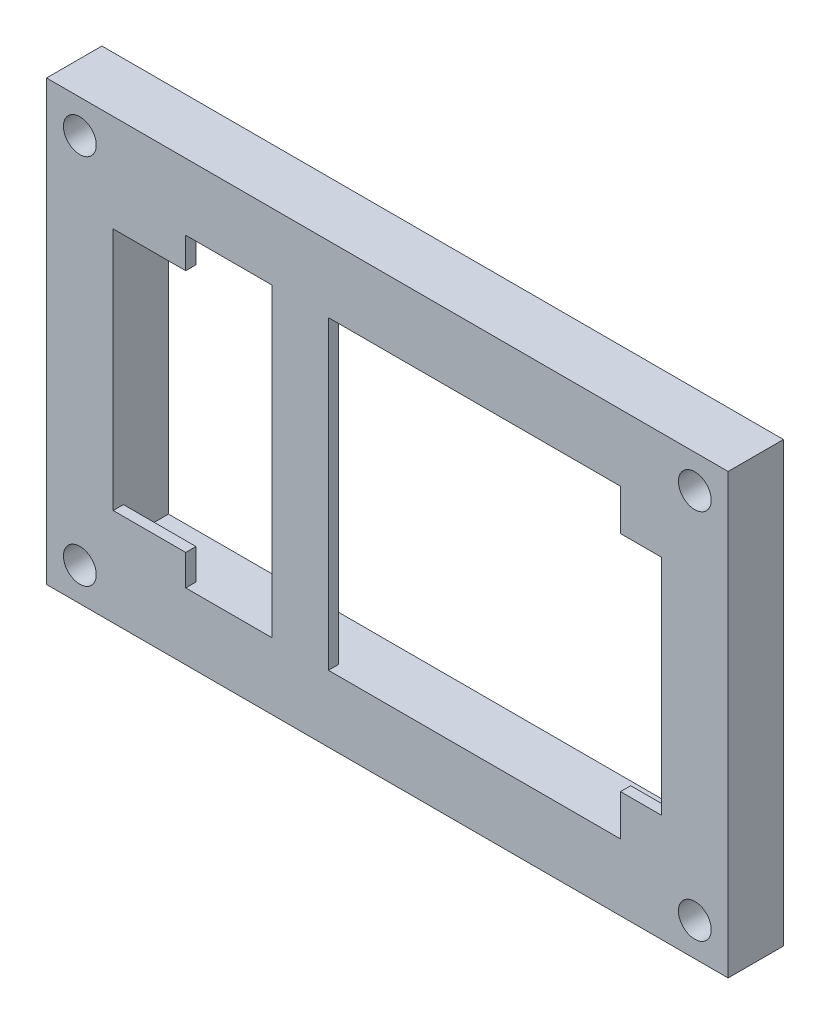
ISO-10303-21;
HEADER;
FILE_DESCRIPTION(('STEP AP214'),'2;1');
FILE_NAME('part.step','',(''),(''),'','','');
FILE_SCHEMA(('AUTOMOTIVE_DESIGN { 1 0 10303 214 1 1 1 1 }'));
ENDSEC;
DATA;
#1=APPLICATION_CONTEXT('core data for automotive mechanical design processes');
#2=APPLICATION_PROTOCOL_DEFINITION('international standard','automotive_design',2000,#1);
#3=PRODUCT_CONTEXT('',#1,'mechanical');
#4=PRODUCT('Part','Part','',(#3));
#5=PRODUCT_RELATED_PRODUCT_CATEGORY('part','',(#4));
#6=PRODUCT_DEFINITION_FORMATION('','',#4);
#7=PRODUCT_DEFINITION_CONTEXT('part definition',#1,'design');
#8=PRODUCT_DEFINITION('design','',#6,#7);
#9=PRODUCT_DEFINITION_SHAPE('','',#8);
#10=(LENGTH_UNIT() NAMED_UNIT(*) SI_UNIT(.MILLI.,.METRE.));
#11=(NAMED_UNIT(*) PLANE_ANGLE_UNIT() SI_UNIT($,.RADIAN.));
#12=(NAMED_UNIT(*) SI_UNIT($,.STERADIAN.) SOLID_ANGLE_UNIT());
#13=UNCERTAINTY_MEASURE_WITH_UNIT(LENGTH_MEASURE(1.E-05),#10,'distance_accuracy_value','');
#14=(GEOMETRIC_REPRESENTATION_CONTEXT(3) GLOBAL_UNCERTAINTY_ASSIGNED_CONTEXT((#13)) GLOBAL_UNIT_ASSIGNED_CONTEXT((#10,
#11,#12)) REPRESENTATION_CONTEXT('',''));
#15=CARTESIAN_POINT('',(0.,0.,0.));
#16=DIRECTION('',(0.,0.,1.));
#17=DIRECTION('',(1.,0.,0.));
#18=AXIS2_PLACEMENT_3D('',#15,#16,#17);
#19=CARTESIAN_POINT('',(-95.848753826431,54.5182768069801,0.));
#20=DIRECTION('',(-1.,0.,0.));
#21=DIRECTION('',(0.,-1.,0.));
#22=AXIS2_PLACEMENT_3D('',#19,#20,#21);
#23=PLANE('',#22);
#24=DIRECTION('',(0.,-1.,0.));
#25=VECTOR('',#24,1.);
#26=CARTESIAN_POINT('',(-95.8487538264309,27.7182768069801,4.4));
#27=LINE('',#26,#25);
#28=CARTESIAN_POINT('',(-95.8487538264309,27.7182768069801,4.4));
#29=VERTEX_POINT('',#28);
#30=CARTESIAN_POINT('',(-95.8487538264309,24.7182768069801,4.4));
#31=VERTEX_POINT('',#30);
#32=EDGE_CURVE('E220',#29,#31,#27,.T.);
#33=ORIENTED_EDGE('',*,*,#32,.T.);
#34=DIRECTION('',(0.,0.,1.));
#35=VECTOR('',#34,1.);
#36=CARTESIAN_POINT('',(-95.8487538264309,24.7182768069801,0.));
#37=LINE('',#36,#35);
#38=CARTESIAN_POINT('',(-95.8487538264309,24.7182768069801,0.));
#39=VERTEX_POINT('',#38);
#40=EDGE_CURVE('E364',#39,#31,#37,.T.);
#41=ORIENTED_EDGE('',*,*,#40,.F.);
#42=DIRECTION('',(0.,-1.,0.));
#43=VECTOR('',#42,1.);
#44=CARTESIAN_POINT('',(-95.848753826431,54.5182768069801,0.));
#45=LINE('',#44,#43);
#46=CARTESIAN_POINT('',(-95.848753826431,54.5182768069801,0.));
#47=VERTEX_POINT('',#46);
#48=EDGE_CURVE('E344',#47,#39,#45,.T.);
#49=ORIENTED_EDGE('',*,*,#48,.F.);
#50=DIRECTION('',(0.,0.,1.));
#51=VECTOR('',#50,1.);
#52=CARTESIAN_POINT('',(-95.848753826431,54.5182768069801,0.));
#53=LINE('',#52,#51);
#54=CARTESIAN_POINT('',(-95.848753826431,54.5182768069801,4.4));
#55=VERTEX_POINT('',#54);
#56=EDGE_CURVE('E366',#47,#55,#53,.T.);
#57=ORIENTED_EDGE('',*,*,#56,.T.);
#58=DIRECTION('',(0.,1.,0.));
#59=VECTOR('',#58,1.);
#60=CARTESIAN_POINT('',(-95.848753826431,51.5182768069801,4.4));
#61=LINE('',#60,#59);
#62=CARTESIAN_POINT('',(-95.848753826431,51.5182768069801,4.4));
#63=VERTEX_POINT('',#62);
#64=EDGE_CURVE('E247',#63,#55,#61,.T.);
#65=ORIENTED_EDGE('',*,*,#64,.F.);
#66=DIRECTION('',(0.,0.,-1.));
#67=VECTOR('',#66,1.);
#68=CARTESIAN_POINT('',(-95.848753826431,51.5182768069801,5.4));
#69=LINE('',#68,#67);
#70=CARTESIAN_POINT('',(-95.848753826431,51.5182768069801,5.4));
#71=VERTEX_POINT('',#70);
#72=EDGE_CURVE('E229',#71,#63,#69,.T.);
#73=ORIENTED_EDGE('',*,*,#72,.F.);
#74=DIRECTION('',(0.,-1.,0.));
#75=VECTOR('',#74,1.);
#76=CARTESIAN_POINT('',(-95.848753826431,54.5182768069801,5.4));
#77=LINE('',#76,#75);
#78=CARTESIAN_POINT('',(-95.8487538264309,27.7182768069801,5.4));
#79=VERTEX_POINT('',#78);
#80=EDGE_CURVE('E356',#71,#79,#77,.T.);
#81=ORIENTED_EDGE('',*,*,#80,.T.);
#82=DIRECTION('',(0.,0.,1.));
#83=VECTOR('',#82,1.);
#84=CARTESIAN_POINT('',(-95.8487538264309,27.7182768069801,5.4));
#85=LINE('',#84,#83);
#86=EDGE_CURVE('E49',#29,#79,#85,.T.);
#87=ORIENTED_EDGE('',*,*,#86,.F.);
#88=EDGE_LOOP('',(#33,#41,#49,#57,#65,#73,#81,#87));
#89=FACE_BOUND('',#88,.T.);
#90=ADVANCED_FACE('F32',(#89),#23,.F.);
#91=CARTESIAN_POINT('',(-42.3487538264309,24.7182768069801,0.));
#92=DIRECTION('',(0.,-1.,0.));
#93=DIRECTION('',(1.,0.,0.));
#94=AXIS2_PLACEMENT_3D('',#91,#92,#93);
#95=PLANE('',#94);
#96=DIRECTION('',(0.,0.,-1.));
#97=VECTOR('',#96,1.);
#98=CARTESIAN_POINT('',(-88.7687538264309,24.7182768069801,5.4));
#99=LINE('',#98,#97);
#100=CARTESIAN_POINT('',(-88.7687538264309,24.7182768069801,5.4));
#101=VERTEX_POINT('',#100);
#102=CARTESIAN_POINT('',(-88.7687538264309,24.7182768069801,4.4));
#103=VERTEX_POINT('',#102);
#104=EDGE_CURVE('E224',#101,#103,#99,.T.);
#105=ORIENTED_EDGE('',*,*,#104,.F.);
#106=DIRECTION('',(1.,0.,0.));
#107=VECTOR('',#106,1.);
#108=CARTESIAN_POINT('',(-42.3487538264309,24.7182768069801,5.4));
#109=LINE('',#108,#107);
#110=CARTESIAN_POINT('',(-80.348753826431,24.7182768069801,5.4));
#111=VERTEX_POINT('',#110);
#112=EDGE_CURVE('E210',#101,#111,#109,.T.);
#113=ORIENTED_EDGE('',*,*,#112,.T.);
#114=DIRECTION('',(0.,0.,-1.));
#115=VECTOR('',#114,1.);
#116=CARTESIAN_POINT('',(-80.348753826431,24.7182768069801,5.4));
#117=LINE('',#116,#115);
#118=CARTESIAN_POINT('',(-80.348753826431,24.7182768069801,4.4));
#119=VERTEX_POINT('',#118);
#120=EDGE_CURVE('E315',#111,#119,#117,.T.);
#121=ORIENTED_EDGE('',*,*,#120,.T.);
#122=DIRECTION('',(1.,0.,0.));
#123=VECTOR('',#122,1.);
#124=CARTESIAN_POINT('',(-80.348753826431,24.7182768069801,4.4));
#125=LINE('',#124,#123);
#126=CARTESIAN_POINT('',(-74.8487538264309,24.7182768069801,4.4));
#127=VERTEX_POINT('',#126);
#128=EDGE_CURVE('E312',#119,#127,#125,.T.);
#129=ORIENTED_EDGE('',*,*,#128,.T.);
#130=DIRECTION('',(0.,0.,1.));
#131=VECTOR('',#130,1.);
#132=CARTESIAN_POINT('',(-74.8487538264309,24.7182768069801,4.4));
#133=LINE('',#132,#131);
#134=CARTESIAN_POINT('',(-74.8487538264309,24.7182768069801,5.4));
#135=VERTEX_POINT('',#134);
#136=EDGE_CURVE('E302',#127,#135,#133,.T.);
#137=ORIENTED_EDGE('',*,*,#136,.T.);
#138=CARTESIAN_POINT('',(-46.3487538264309,24.7182768069801,5.4));
#139=VERTEX_POINT('',#138);
#140=EDGE_CURVE('E358',#135,#139,#109,.T.);
#141=ORIENTED_EDGE('',*,*,#140,.T.);
#142=DIRECTION('',(0.,0.,1.));
#143=VECTOR('',#142,1.);
#144=CARTESIAN_POINT('',(-46.3487538264309,24.7182768069801,5.4));
#145=LINE('',#144,#143);
#146=CARTESIAN_POINT('',(-46.3487538264309,24.7182768069801,4.4));
#147=VERTEX_POINT('',#146);
#148=EDGE_CURVE('E254',#147,#139,#145,.T.);
#149=ORIENTED_EDGE('',*,*,#148,.F.);
#150=DIRECTION('',(-1.,0.,0.));
#151=VECTOR('',#150,1.);
#152=CARTESIAN_POINT('',(-42.3487538264309,24.7182768069801,4.4));
#153=LINE('',#152,#151);
#154=CARTESIAN_POINT('',(-42.3487538264309,24.7182768069801,4.4));
#155=VERTEX_POINT('',#154);
#156=EDGE_CURVE('E249',#155,#147,#153,.T.);
#157=ORIENTED_EDGE('',*,*,#156,.F.);
#158=DIRECTION('',(0.,0.,1.));
#159=VECTOR('',#158,1.);
#160=CARTESIAN_POINT('',(-42.3487538264309,24.7182768069801,0.));
#161=LINE('',#160,#159);
#162=CARTESIAN_POINT('',(-42.3487538264309,24.7182768069801,0.));
#163=VERTEX_POINT('',#162);
#164=EDGE_CURVE('E360',#163,#155,#161,.T.);
#165=ORIENTED_EDGE('',*,*,#164,.F.);
#166=DIRECTION('',(1.,0.,0.));
#167=VECTOR('',#166,1.);
#168=CARTESIAN_POINT('',(-42.3487538264309,24.7182768069801,0.));
#169=LINE('',#168,#167);
#170=EDGE_CURVE('E347',#39,#163,#169,.T.);
#171=ORIENTED_EDGE('',*,*,#170,.F.);
#172=ORIENTED_EDGE('',*,*,#40,.T.);
#173=DIRECTION('',(-1.,0.,0.));
#174=VECTOR('',#173,1.);
#175=CARTESIAN_POINT('',(-95.8487538264309,24.7182768069801,4.4));
#176=LINE('',#175,#174);
#177=EDGE_CURVE('E57',#103,#31,#176,.T.);
#178=ORIENTED_EDGE('',*,*,#177,.F.);
#179=EDGE_LOOP('',(#105,#113,#121,#129,#137,#141,#149,#157,#165,#171,#172,#178));
#180=FACE_BOUND('',#179,.T.);
#181=ADVANCED_FACE('F427',(#180),#95,.F.);
#182=CARTESIAN_POINT('',(-42.3487538264309,54.5182768069801,0.));
#183=DIRECTION('',(0.,1.,0.));
#184=DIRECTION('',(-1.,0.,0.));
#185=AXIS2_PLACEMENT_3D('',#182,#183,#184);
#186=PLANE('',#185);
#187=DIRECTION('',(1.,0.,0.));
#188=VECTOR('',#187,1.);
#189=CARTESIAN_POINT('',(-95.848753826431,54.5182768069801,4.4));
#190=LINE('',#189,#188);
#191=CARTESIAN_POINT('',(-88.7687398066959,54.5182768069801,4.4));
#192=VERTEX_POINT('',#191);
#193=EDGE_CURVE('E212',#55,#192,#190,.T.);
#194=ORIENTED_EDGE('',*,*,#193,.F.);
#195=ORIENTED_EDGE('',*,*,#56,.F.);
#196=DIRECTION('',(-1.,0.,0.));
#197=VECTOR('',#196,1.);
#198=CARTESIAN_POINT('',(-42.3487538264309,54.5182768069801,0.));
#199=LINE('',#198,#197);
#200=CARTESIAN_POINT('',(-42.3487538264309,54.5182768069801,0.));
#201=VERTEX_POINT('',#200);
#202=EDGE_CURVE('E341',#201,#47,#199,.T.);
#203=ORIENTED_EDGE('',*,*,#202,.F.);
#204=DIRECTION('',(0.,0.,1.));
#205=VECTOR('',#204,1.);
#206=CARTESIAN_POINT('',(-42.3487538264309,54.5182768069801,0.));
#207=LINE('',#206,#205);
#208=CARTESIAN_POINT('',(-42.3487538264309,54.5182768069801,4.4));
#209=VERTEX_POINT('',#208);
#210=EDGE_CURVE('E350',#201,#209,#207,.T.);
#211=ORIENTED_EDGE('',*,*,#210,.T.);
#212=DIRECTION('',(1.,0.,0.));
#213=VECTOR('',#212,1.);
#214=CARTESIAN_POINT('',(-42.3487538264309,54.5182768069801,4.4));
#215=LINE('',#214,#213);
#216=CARTESIAN_POINT('',(-46.3487538264309,54.5182768069801,4.4));
#217=VERTEX_POINT('',#216);
#218=EDGE_CURVE('E279',#217,#209,#215,.T.);
#219=ORIENTED_EDGE('',*,*,#218,.F.);
#220=DIRECTION('',(0.,0.,-1.));
#221=VECTOR('',#220,1.);
#222=CARTESIAN_POINT('',(-46.3487538264309,54.5182768069801,5.4));
#223=LINE('',#222,#221);
#224=CARTESIAN_POINT('',(-46.3487538264309,54.5182768069801,5.4));
#225=VERTEX_POINT('',#224);
#226=EDGE_CURVE('E274',#225,#217,#223,.T.);
#227=ORIENTED_EDGE('',*,*,#226,.F.);
#228=DIRECTION('',(-1.,0.,0.));
#229=VECTOR('',#228,1.);
#230=CARTESIAN_POINT('',(-42.3487538264309,54.5182768069801,5.4));
#231=LINE('',#230,#229);
#232=CARTESIAN_POINT('',(-74.8487538264309,54.5182768069801,5.4));
#233=VERTEX_POINT('',#232);
#234=EDGE_CURVE('E354',#225,#233,#231,.T.);
#235=ORIENTED_EDGE('',*,*,#234,.T.);
#236=DIRECTION('',(0.,0.,1.));
#237=VECTOR('',#236,1.);
#238=CARTESIAN_POINT('',(-74.8487538264309,54.5182768069801,4.4));
#239=LINE('',#238,#237);
#240=CARTESIAN_POINT('',(-74.8487538264309,54.5182768069801,4.4));
#241=VERTEX_POINT('',#240);
#242=EDGE_CURVE('E299',#241,#233,#239,.T.);
#243=ORIENTED_EDGE('',*,*,#242,.F.);
#244=DIRECTION('',(1.,0.,0.));
#245=VECTOR('',#244,1.);
#246=CARTESIAN_POINT('',(-80.348753826431,54.5182768069801,4.4));
#247=LINE('',#246,#245);
#248=CARTESIAN_POINT('',(-80.348753826431,54.5182768069801,4.4));
#249=VERTEX_POINT('',#248);
#250=EDGE_CURVE('E304',#249,#241,#247,.T.);
#251=ORIENTED_EDGE('',*,*,#250,.F.);
#252=DIRECTION('',(0.,0.,-1.));
#253=VECTOR('',#252,1.);
#254=CARTESIAN_POINT('',(-80.348753826431,54.5182768069801,5.4));
#255=LINE('',#254,#253);
#256=CARTESIAN_POINT('',(-80.3487538264309,54.5182768069801,5.4));
#257=VERTEX_POINT('',#256);
#258=EDGE_CURVE('E308',#257,#249,#255,.T.);
#259=ORIENTED_EDGE('',*,*,#258,.F.);
#260=CARTESIAN_POINT('',(-88.7687398066959,54.5182768069801,5.4));
#261=VERTEX_POINT('',#260);
#262=EDGE_CURVE('E353',#257,#261,#231,.T.);
#263=ORIENTED_EDGE('',*,*,#262,.T.);
#264=DIRECTION('',(0.,0.,1.));
#265=VECTOR('',#264,1.);
#266=CARTESIAN_POINT('',(-88.7687398066959,54.5182768069801,5.4));
#267=LINE('',#266,#265);
#268=EDGE_CURVE('E233',#192,#261,#267,.T.);
#269=ORIENTED_EDGE('',*,*,#268,.F.);
#270=EDGE_LOOP('',(#194,#195,#203,#211,#219,#227,#235,#243,#251,#259,#263,#269));
#271=FACE_BOUND('',#270,.T.);
#272=ADVANCED_FACE('F432',(#271),#186,.F.);
#273=CARTESIAN_POINT('',(-42.3487538264309,54.5182768069801,0.));
#274=DIRECTION('',(1.,0.,0.));
#275=DIRECTION('',(0.,1.,0.));
#276=AXIS2_PLACEMENT_3D('',#273,#274,#275);
#277=PLANE('',#276);
#278=DIRECTION('',(0.,-1.,0.));
#279=VECTOR('',#278,1.);
#280=CARTESIAN_POINT('',(-42.3487538264309,28.7182768069801,4.4));
#281=LINE('',#280,#279);
#282=CARTESIAN_POINT('',(-42.3487538264309,28.7182768069801,4.4));
#283=VERTEX_POINT('',#282);
#284=EDGE_CURVE('E271',#283,#155,#281,.T.);
#285=ORIENTED_EDGE('',*,*,#284,.F.);
#286=DIRECTION('',(0.,0.,-1.));
#287=VECTOR('',#286,1.);
#288=CARTESIAN_POINT('',(-42.3487538264309,28.7182768069801,5.4));
#289=LINE('',#288,#287);
#290=CARTESIAN_POINT('',(-42.3487538264309,28.7182768069801,5.4));
#291=VERTEX_POINT('',#290);
#292=EDGE_CURVE('E250',#291,#283,#289,.T.);
#293=ORIENTED_EDGE('',*,*,#292,.F.);
#294=DIRECTION('',(0.,1.,0.));
#295=VECTOR('',#294,1.);
#296=CARTESIAN_POINT('',(-42.3487538264309,54.5182768069801,5.4));
#297=LINE('',#296,#295);
#298=CARTESIAN_POINT('',(-42.3487538264309,50.5182768069801,5.4));
#299=VERTEX_POINT('',#298);
#300=EDGE_CURVE('E351',#291,#299,#297,.T.);
#301=ORIENTED_EDGE('',*,*,#300,.T.);
#302=DIRECTION('',(0.,0.,1.));
#303=VECTOR('',#302,1.);
#304=CARTESIAN_POINT('',(-42.3487538264309,50.5182768069801,5.4));
#305=LINE('',#304,#303);
#306=CARTESIAN_POINT('',(-42.3487538264309,50.5182768069801,4.4));
#307=VERTEX_POINT('',#306);
#308=EDGE_CURVE('E275',#307,#299,#305,.T.);
#309=ORIENTED_EDGE('',*,*,#308,.F.);
#310=DIRECTION('',(0.,1.,0.));
#311=VECTOR('',#310,1.);
#312=CARTESIAN_POINT('',(-42.3487538264309,50.5182768069801,4.4));
#313=LINE('',#312,#311);
#314=EDGE_CURVE('E286',#307,#209,#313,.T.);
#315=ORIENTED_EDGE('',*,*,#314,.T.);
#316=ORIENTED_EDGE('',*,*,#210,.F.);
#317=DIRECTION('',(0.,1.,0.));
#318=VECTOR('',#317,1.);
#319=CARTESIAN_POINT('',(-42.3487538264309,54.5182768069801,0.));
#320=LINE('',#319,#318);
#321=EDGE_CURVE('E338',#163,#201,#320,.T.);
#322=ORIENTED_EDGE('',*,*,#321,.F.);
#323=ORIENTED_EDGE('',*,*,#164,.T.);
#324=EDGE_LOOP('',(#285,#293,#301,#309,#315,#316,#322,#323));
#325=FACE_BOUND('',#324,.T.);
#326=ADVANCED_FACE('F437',(#325),#277,.F.);
#327=CARTESIAN_POINT('',(-102.348753826431,61.0182768069801,5.4));
#328=DIRECTION('',(1.,0.,0.));
#329=DIRECTION('',(0.,1.,0.));
#330=AXIS2_PLACEMENT_3D('',#327,#328,#329);
#331=PLANE('',#330);
#332=DIRECTION('',(0.,-1.,0.));
#333=VECTOR('',#332,1.);
#334=CARTESIAN_POINT('',(-102.348753826431,61.0182768069801,0.));
#335=LINE('',#334,#333);
#336=CARTESIAN_POINT('',(-102.348753826431,61.0182768069801,0.));
#337=VERTEX_POINT('',#336);
#338=CARTESIAN_POINT('',(-102.348753826431,18.2182768069801,0.));
#339=VERTEX_POINT('',#338);
#340=EDGE_CURVE('E363',#337,#339,#335,.T.);
#341=ORIENTED_EDGE('',*,*,#340,.T.);
#342=DIRECTION('',(0.,0.,-1.));
#343=VECTOR('',#342,1.);
#344=CARTESIAN_POINT('',(-102.348753826431,18.2182768069801,5.4));
#345=LINE('',#344,#343);
#346=CARTESIAN_POINT('',(-102.348753826431,18.2182768069801,5.4));
#347=VERTEX_POINT('',#346);
#348=EDGE_CURVE('E11',#347,#339,#345,.T.);
#349=ORIENTED_EDGE('',*,*,#348,.F.);
#350=DIRECTION('',(0.,-1.,0.));
#351=VECTOR('',#350,1.);
#352=CARTESIAN_POINT('',(-102.348753826431,61.0182768069801,5.4));
#353=LINE('',#352,#351);
#354=CARTESIAN_POINT('',(-102.348753826431,61.0182768069801,5.4));
#355=VERTEX_POINT('',#354);
#356=EDGE_CURVE('E371',#355,#347,#353,.T.);
#357=ORIENTED_EDGE('',*,*,#356,.F.);
#358=DIRECTION('',(0.,0.,-1.));
#359=VECTOR('',#358,1.);
#360=CARTESIAN_POINT('',(-102.348753826431,61.0182768069801,5.4));
#361=LINE('',#360,#359);
#362=EDGE_CURVE('E381',#355,#337,#361,.T.);
#363=ORIENTED_EDGE('',*,*,#362,.T.);
#364=EDGE_LOOP('',(#341,#349,#357,#363));
#365=FACE_BOUND('',#364,.T.);
#366=ADVANCED_FACE('F34',(#365),#331,.F.);
#367=CARTESIAN_POINT('',(-102.348753826431,18.2182768069801,5.4));
#368=DIRECTION('',(0.,1.,0.));
#369=DIRECTION('',(0.,0.,1.));
#370=AXIS2_PLACEMENT_3D('',#367,#368,#369);
#371=PLANE('',#370);
#372=DIRECTION('',(1.,0.,0.));
#373=VECTOR('',#372,1.);
#374=CARTESIAN_POINT('',(-102.348753826431,18.2182768069801,0.));
#375=LINE('',#374,#373);
#376=CARTESIAN_POINT('',(-35.8487538264309,18.2182768069801,0.));
#377=VERTEX_POINT('',#376);
#378=EDGE_CURVE('E384',#339,#377,#375,.T.);
#379=ORIENTED_EDGE('',*,*,#378,.T.);
#380=DIRECTION('',(0.,0.,-1.));
#381=VECTOR('',#380,1.);
#382=CARTESIAN_POINT('',(-35.8487538264309,18.2182768069801,5.4));
#383=LINE('',#382,#381);
#384=CARTESIAN_POINT('',(-35.8487538264309,18.2182768069801,5.4));
#385=VERTEX_POINT('',#384);
#386=EDGE_CURVE('E41',#385,#377,#383,.T.);
#387=ORIENTED_EDGE('',*,*,#386,.F.);
#388=DIRECTION('',(1.,0.,0.));
#389=VECTOR('',#388,1.);
#390=CARTESIAN_POINT('',(-102.348753826431,18.2182768069801,5.4));
#391=LINE('',#390,#389);
#392=EDGE_CURVE('E374',#347,#385,#391,.T.);
#393=ORIENTED_EDGE('',*,*,#392,.F.);
#394=ORIENTED_EDGE('',*,*,#348,.T.);
#395=EDGE_LOOP('',(#379,#387,#393,#394));
#396=FACE_BOUND('',#395,.T.);
#397=ADVANCED_FACE('F454',(#396),#371,.F.);
#398=CARTESIAN_POINT('',(-35.848753826431,61.0182768069801,5.4));
#399=DIRECTION('',(-1.,0.,0.));
#400=DIRECTION('',(0.,-1.,0.));
#401=AXIS2_PLACEMENT_3D('',#398,#399,#400);
#402=PLANE('',#401);
#403=DIRECTION('',(0.,1.,0.));
#404=VECTOR('',#403,1.);
#405=CARTESIAN_POINT('',(-35.848753826431,61.0182768069801,0.));
#406=LINE('',#405,#404);
#407=CARTESIAN_POINT('',(-35.848753826431,61.0182768069801,0.));
#408=VERTEX_POINT('',#407);
#409=EDGE_CURVE('E386',#377,#408,#406,.T.);
#410=ORIENTED_EDGE('',*,*,#409,.T.);
#411=DIRECTION('',(0.,0.,-1.));
#412=VECTOR('',#411,1.);
#413=CARTESIAN_POINT('',(-35.848753826431,61.0182768069801,5.4));
#414=LINE('',#413,#412);
#415=CARTESIAN_POINT('',(-35.848753826431,61.0182768069801,5.4));
#416=VERTEX_POINT('',#415);
#417=EDGE_CURVE('E391',#416,#408,#414,.T.);
#418=ORIENTED_EDGE('',*,*,#417,.F.);
#419=DIRECTION('',(0.,1.,0.));
#420=VECTOR('',#419,1.);
#421=CARTESIAN_POINT('',(-35.848753826431,61.0182768069801,5.4));
#422=LINE('',#421,#420);
#423=EDGE_CURVE('E377',#385,#416,#422,.T.);
#424=ORIENTED_EDGE('',*,*,#423,.F.);
#425=ORIENTED_EDGE('',*,*,#386,.T.);
#426=EDGE_LOOP('',(#410,#418,#424,#425));
#427=FACE_BOUND('',#426,.T.);
#428=ADVANCED_FACE('F451',(#427),#402,.F.);
#429=CARTESIAN_POINT('',(-102.348753826431,61.0182768069801,5.4));
#430=DIRECTION('',(0.,-1.,0.));
#431=DIRECTION('',(0.,0.,-1.));
#432=AXIS2_PLACEMENT_3D('',#429,#430,#431);
#433=PLANE('',#432);
#434=DIRECTION('',(-1.,0.,0.));
#435=VECTOR('',#434,1.);
#436=CARTESIAN_POINT('',(-102.348753826431,61.0182768069801,0.));
#437=LINE('',#436,#435);
#438=EDGE_CURVE('E375',#408,#337,#437,.T.);
#439=ORIENTED_EDGE('',*,*,#438,.T.);
#440=ORIENTED_EDGE('',*,*,#362,.F.);
#441=DIRECTION('',(-1.,0.,0.));
#442=VECTOR('',#441,1.);
#443=CARTESIAN_POINT('',(-102.348753826431,61.0182768069801,5.4));
#444=LINE('',#443,#442);
#445=EDGE_CURVE('E379',#416,#355,#444,.T.);
#446=ORIENTED_EDGE('',*,*,#445,.F.);
#447=ORIENTED_EDGE('',*,*,#417,.T.);
#448=EDGE_LOOP('',(#439,#440,#446,#447));
#449=FACE_BOUND('',#448,.T.);
#450=ADVANCED_FACE('F444',(#449),#433,.F.);
#451=CARTESIAN_POINT('',(0.,0.,5.4));
#452=DIRECTION('',(0.,0.,1.));
#453=DIRECTION('',(1.,0.,0.));
#454=AXIS2_PLACEMENT_3D('',#451,#452,#453);
#455=PLANE('',#454);
#456=ORIENTED_EDGE('',*,*,#300,.F.);
#457=DIRECTION('',(1.,0.,0.));
#458=VECTOR('',#457,1.);
#459=CARTESIAN_POINT('',(-42.3487538264309,28.7182768069801,5.4));
#460=LINE('',#459,#458);
#461=CARTESIAN_POINT('',(-46.3487538264309,28.7182768069801,5.4));
#462=VERTEX_POINT('',#461);
#463=EDGE_CURVE('E258',#462,#291,#460,.T.);
#464=ORIENTED_EDGE('',*,*,#463,.F.);
#465=DIRECTION('',(0.,-1.,0.));
#466=VECTOR('',#465,1.);
#467=CARTESIAN_POINT('',(-46.3487538264309,28.7182768069801,5.4));
#468=LINE('',#467,#466);
#469=EDGE_CURVE('E261',#462,#139,#468,.T.);
#470=ORIENTED_EDGE('',*,*,#469,.T.);
#471=ORIENTED_EDGE('',*,*,#140,.F.);
#472=DIRECTION('',(0.,1.,0.));
#473=VECTOR('',#472,1.);
#474=CARTESIAN_POINT('',(-74.8487538264309,19.1281068632306,5.4));
#475=LINE('',#474,#473);
#476=EDGE_CURVE('E298',#135,#233,#475,.T.);
#477=ORIENTED_EDGE('',*,*,#476,.T.);
#478=ORIENTED_EDGE('',*,*,#234,.F.);
#479=DIRECTION('',(0.,1.,0.));
#480=VECTOR('',#479,1.);
#481=CARTESIAN_POINT('',(-46.3487538264309,50.5182768069801,5.4));
#482=LINE('',#481,#480);
#483=CARTESIAN_POINT('',(-46.3487538264309,50.5182768069801,5.4));
#484=VERTEX_POINT('',#483);
#485=EDGE_CURVE('E295',#484,#225,#482,.T.);
#486=ORIENTED_EDGE('',*,*,#485,.F.);
#487=DIRECTION('',(-1.,0.,0.));
#488=VECTOR('',#487,1.);
#489=CARTESIAN_POINT('',(-42.3487538264309,50.5182768069801,5.4));
#490=LINE('',#489,#488);
#491=EDGE_CURVE('E278',#299,#484,#490,.T.);
#492=ORIENTED_EDGE('',*,*,#491,.F.);
#493=EDGE_LOOP('',(#456,#464,#470,#471,#477,#478,#486,#492));
#494=FACE_BOUND('',#493,.T.);
#495=DIRECTION('',(0.,1.,0.));
#496=VECTOR('',#495,1.);
#497=CARTESIAN_POINT('',(-80.348753826431,19.1281068632306,5.4));
#498=LINE('',#497,#496);
#499=EDGE_CURVE('E311',#111,#257,#498,.T.);
#500=ORIENTED_EDGE('',*,*,#499,.F.);
#501=ORIENTED_EDGE('',*,*,#112,.F.);
#502=DIRECTION('',(0.,-1.,0.));
#503=VECTOR('',#502,1.);
#504=CARTESIAN_POINT('',(-88.7687538264309,27.7182768069801,5.4));
#505=LINE('',#504,#503);
#506=CARTESIAN_POINT('',(-88.7687538264309,27.7182768069801,5.4));
#507=VERTEX_POINT('',#506);
#508=EDGE_CURVE('E206',#507,#101,#505,.T.);
#509=ORIENTED_EDGE('',*,*,#508,.F.);
#510=DIRECTION('',(1.,0.,0.));
#511=VECTOR('',#510,1.);
#512=CARTESIAN_POINT('',(-95.8487538264309,27.7182768069801,5.4));
#513=LINE('',#512,#511);
#514=EDGE_CURVE('E196',#79,#507,#513,.T.);
#515=ORIENTED_EDGE('',*,*,#514,.F.);
#516=ORIENTED_EDGE('',*,*,#80,.F.);
#517=DIRECTION('',(-1.,0.,0.));
#518=VECTOR('',#517,1.);
#519=CARTESIAN_POINT('',(-95.848753826431,51.5182768069801,5.4));
#520=LINE('',#519,#518);
#521=CARTESIAN_POINT('',(-88.7687398066959,51.5182768069801,5.4));
#522=VERTEX_POINT('',#521);
#523=EDGE_CURVE('E237',#522,#71,#520,.T.);
#524=ORIENTED_EDGE('',*,*,#523,.F.);
#525=DIRECTION('',(0.,1.,0.));
#526=VECTOR('',#525,1.);
#527=CARTESIAN_POINT('',(-88.7687398066959,51.5182768069801,5.4));
#528=LINE('',#527,#526);
#529=EDGE_CURVE('E239',#522,#261,#528,.T.);
#530=ORIENTED_EDGE('',*,*,#529,.T.);
#531=ORIENTED_EDGE('',*,*,#262,.F.);
#532=EDGE_LOOP('',(#500,#501,#509,#515,#516,#524,#530,#531));
#533=FACE_BOUND('',#532,.T.);
#534=CARTESIAN_POINT('',(-99.098753826431,21.4682768069801,5.4));
#535=DIRECTION('',(0.,0.,1.));
#536=DIRECTION('',(1.,0.,0.));
#537=AXIS2_PLACEMENT_3D('',#534,#535,#536);
#538=CIRCLE('',#537,1.6);
#539=CARTESIAN_POINT('',(-97.4987538264309,21.4682768069801,5.4));
#540=VERTEX_POINT('',#539);
#541=EDGE_CURVE('E314',#540,#540,#538,.T.);
#542=ORIENTED_EDGE('',*,*,#541,.F.);
#543=EDGE_LOOP('',(#542));
#544=FACE_BOUND('',#543,.T.);
#545=CARTESIAN_POINT('',(-39.0987538264309,21.4682768069801,5.4));
#546=DIRECTION('',(0.,0.,1.));
#547=DIRECTION('',(1.,0.,0.));
#548=AXIS2_PLACEMENT_3D('',#545,#546,#547);
#549=CIRCLE('',#548,1.6);
#550=CARTESIAN_POINT('',(-37.4987538264309,21.4682768069801,5.4));
#551=VERTEX_POINT('',#550);
#552=EDGE_CURVE('E330',#551,#551,#549,.T.);
#553=ORIENTED_EDGE('',*,*,#552,.F.);
#554=EDGE_LOOP('',(#553));
#555=FACE_BOUND('',#554,.T.);
#556=CARTESIAN_POINT('',(-39.0987538264309,57.7682768069801,5.4));
#557=DIRECTION('',(0.,0.,1.));
#558=DIRECTION('',(1.,0.,0.));
#559=AXIS2_PLACEMENT_3D('',#556,#557,#558);
#560=CIRCLE('',#559,1.6);
#561=CARTESIAN_POINT('',(-37.4987538264309,57.7682768069801,5.4));
#562=VERTEX_POINT('',#561);
#563=EDGE_CURVE('E326',#562,#562,#560,.T.);
#564=ORIENTED_EDGE('',*,*,#563,.F.);
#565=EDGE_LOOP('',(#564));
#566=FACE_BOUND('',#565,.T.);
#567=CARTESIAN_POINT('',(-99.098753826431,57.7682768069801,5.4));
#568=DIRECTION('',(0.,0.,1.));
#569=DIRECTION('',(1.,0.,0.));
#570=AXIS2_PLACEMENT_3D('',#567,#568,#569);
#571=CIRCLE('',#570,1.60000000000001);
#572=CARTESIAN_POINT('',(-97.4987538264309,57.7682768069801,5.4));
#573=VERTEX_POINT('',#572);
#574=EDGE_CURVE('E329',#573,#573,#571,.T.);
#575=ORIENTED_EDGE('',*,*,#574,.F.);
#576=EDGE_LOOP('',(#575));
#577=FACE_BOUND('',#576,.T.);
#578=ORIENTED_EDGE('',*,*,#356,.T.);
#579=ORIENTED_EDGE('',*,*,#392,.T.);
#580=ORIENTED_EDGE('',*,*,#423,.T.);
#581=ORIENTED_EDGE('',*,*,#445,.T.);
#582=EDGE_LOOP('',(#578,#579,#580,#581));
#583=FACE_BOUND('',#582,.T.);
#584=ADVANCED_FACE('F208',(#494,#533,#544,#555,#566,#577,#583),#455,.T.);
#585=CARTESIAN_POINT('',(0.,0.,0.));
#586=DIRECTION('',(0.,0.,1.));
#587=DIRECTION('',(1.,0.,0.));
#588=AXIS2_PLACEMENT_3D('',#585,#586,#587);
#589=PLANE('',#588);
#590=CARTESIAN_POINT('',(-99.098753826431,21.4682768069801,0.));
#591=DIRECTION('',(0.,0.,1.));
#592=DIRECTION('',(1.,0.,0.));
#593=AXIS2_PLACEMENT_3D('',#590,#591,#592);
#594=CIRCLE('',#593,1.6);
#595=CARTESIAN_POINT('',(-97.4987538264309,21.4682768069801,0.));
#596=VERTEX_POINT('',#595);
#597=EDGE_CURVE('E36',#596,#596,#594,.T.);
#598=ORIENTED_EDGE('',*,*,#597,.T.);
#599=EDGE_LOOP('',(#598));
#600=FACE_BOUND('',#599,.T.);
#601=CARTESIAN_POINT('',(-39.0987538264309,21.4682768069801,0.));
#602=DIRECTION('',(0.,0.,1.));
#603=DIRECTION('',(1.,0.,0.));
#604=AXIS2_PLACEMENT_3D('',#601,#602,#603);
#605=CIRCLE('',#604,1.6);
#606=CARTESIAN_POINT('',(-37.4987538264309,21.4682768069801,0.));
#607=VERTEX_POINT('',#606);
#608=EDGE_CURVE('E400',#607,#607,#605,.T.);
#609=ORIENTED_EDGE('',*,*,#608,.T.);
#610=EDGE_LOOP('',(#609));
#611=FACE_BOUND('',#610,.T.);
#612=CARTESIAN_POINT('',(-39.0987538264309,57.7682768069801,0.));
#613=DIRECTION('',(0.,0.,1.));
#614=DIRECTION('',(1.,0.,0.));
#615=AXIS2_PLACEMENT_3D('',#612,#613,#614);
#616=CIRCLE('',#615,1.6);
#617=CARTESIAN_POINT('',(-37.4987538264309,57.7682768069801,0.));
#618=VERTEX_POINT('',#617);
#619=EDGE_CURVE('E398',#618,#618,#616,.T.);
#620=ORIENTED_EDGE('',*,*,#619,.T.);
#621=EDGE_LOOP('',(#620));
#622=FACE_BOUND('',#621,.T.);
#623=CARTESIAN_POINT('',(-99.098753826431,57.7682768069801,0.));
#624=DIRECTION('',(0.,0.,1.));
#625=DIRECTION('',(1.,0.,0.));
#626=AXIS2_PLACEMENT_3D('',#623,#624,#625);
#627=CIRCLE('',#626,1.60000000000001);
#628=CARTESIAN_POINT('',(-97.4987538264309,57.7682768069801,0.));
#629=VERTEX_POINT('',#628);
#630=EDGE_CURVE('E337',#629,#629,#627,.T.);
#631=ORIENTED_EDGE('',*,*,#630,.T.);
#632=EDGE_LOOP('',(#631));
#633=FACE_BOUND('',#632,.T.);
#634=ORIENTED_EDGE('',*,*,#170,.T.);
#635=ORIENTED_EDGE('',*,*,#321,.T.);
#636=ORIENTED_EDGE('',*,*,#202,.T.);
#637=ORIENTED_EDGE('',*,*,#48,.T.);
#638=EDGE_LOOP('',(#634,#635,#636,#637));
#639=FACE_BOUND('',#638,.T.);
#640=ORIENTED_EDGE('',*,*,#340,.F.);
#641=ORIENTED_EDGE('',*,*,#438,.F.);
#642=ORIENTED_EDGE('',*,*,#409,.F.);
#643=ORIENTED_EDGE('',*,*,#378,.F.);
#644=EDGE_LOOP('',(#640,#641,#642,#643));
#645=FACE_BOUND('',#644,.T.);
#646=ADVANCED_FACE('F407',(#600,#611,#622,#633,#639,#645),#589,.F.);
#647=CARTESIAN_POINT('',(-99.098753826431,57.7682768069801,-4.6));
#648=DIRECTION('',(0.,0.,1.));
#649=DIRECTION('',(1.,0.,0.));
#650=AXIS2_PLACEMENT_3D('',#647,#648,#649);
#651=CYLINDRICAL_SURFACE('',#650,1.60000000000001);
#652=ORIENTED_EDGE('',*,*,#574,.T.);
#653=EDGE_LOOP('',(#652));
#654=FACE_BOUND('',#653,.T.);
#655=ORIENTED_EDGE('',*,*,#630,.F.);
#656=EDGE_LOOP('',(#655));
#657=FACE_BOUND('',#656,.T.);
#658=ADVANCED_FACE('F448',(#654,#657),#651,.F.);
#659=CARTESIAN_POINT('',(-39.0987538264309,57.7682768069801,-4.6));
#660=DIRECTION('',(0.,0.,1.));
#661=DIRECTION('',(1.,0.,0.));
#662=AXIS2_PLACEMENT_3D('',#659,#660,#661);
#663=CYLINDRICAL_SURFACE('',#662,1.6);
#664=ORIENTED_EDGE('',*,*,#563,.T.);
#665=EDGE_LOOP('',(#664));
#666=FACE_BOUND('',#665,.T.);
#667=ORIENTED_EDGE('',*,*,#619,.F.);
#668=EDGE_LOOP('',(#667));
#669=FACE_BOUND('',#668,.T.);
#670=ADVANCED_FACE('F422',(#666,#669),#663,.F.);
#671=CARTESIAN_POINT('',(-39.0987538264309,21.4682768069801,-4.6));
#672=DIRECTION('',(0.,0.,1.));
#673=DIRECTION('',(1.,0.,0.));
#674=AXIS2_PLACEMENT_3D('',#671,#672,#673);
#675=CYLINDRICAL_SURFACE('',#674,1.6);
#676=ORIENTED_EDGE('',*,*,#552,.T.);
#677=EDGE_LOOP('',(#676));
#678=FACE_BOUND('',#677,.T.);
#679=ORIENTED_EDGE('',*,*,#608,.F.);
#680=EDGE_LOOP('',(#679));
#681=FACE_BOUND('',#680,.T.);
#682=ADVANCED_FACE('F412',(#678,#681),#675,.F.);
#683=CARTESIAN_POINT('',(-99.098753826431,21.4682768069801,-4.6));
#684=DIRECTION('',(0.,0.,1.));
#685=DIRECTION('',(1.,0.,0.));
#686=AXIS2_PLACEMENT_3D('',#683,#684,#685);
#687=CYLINDRICAL_SURFACE('',#686,1.6);
#688=ORIENTED_EDGE('',*,*,#541,.T.);
#689=EDGE_LOOP('',(#688));
#690=FACE_BOUND('',#689,.T.);
#691=ORIENTED_EDGE('',*,*,#597,.F.);
#692=EDGE_LOOP('',(#691));
#693=FACE_BOUND('',#692,.T.);
#694=ADVANCED_FACE('F409',(#690,#693),#687,.F.);
#695=CARTESIAN_POINT('',(-80.348753826431,19.1281068632306,5.4));
#696=DIRECTION('',(1.,0.,0.));
#697=DIRECTION('',(0.,1.,0.));
#698=AXIS2_PLACEMENT_3D('',#695,#696,#697);
#699=PLANE('',#698);
#700=ORIENTED_EDGE('',*,*,#120,.F.);
#701=ORIENTED_EDGE('',*,*,#499,.T.);
#702=ORIENTED_EDGE('',*,*,#258,.T.);
#703=DIRECTION('',(0.,1.,0.));
#704=VECTOR('',#703,1.);
#705=CARTESIAN_POINT('',(-80.348753826431,19.1281068632306,4.4));
#706=LINE('',#705,#704);
#707=EDGE_CURVE('E307',#119,#249,#706,.T.);
#708=ORIENTED_EDGE('',*,*,#707,.F.);
#709=EDGE_LOOP('',(#700,#701,#702,#708));
#710=FACE_BOUND('',#709,.T.);
#711=ADVANCED_FACE('F411',(#710),#699,.F.);
#712=CARTESIAN_POINT('',(-80.348753826431,19.1281068632306,4.4));
#713=DIRECTION('',(0.,0.,1.));
#714=DIRECTION('',(1.,0.,0.));
#715=AXIS2_PLACEMENT_3D('',#712,#713,#714);
#716=PLANE('',#715);
#717=ORIENTED_EDGE('',*,*,#128,.F.);
#718=ORIENTED_EDGE('',*,*,#707,.T.);
#719=ORIENTED_EDGE('',*,*,#250,.T.);
#720=DIRECTION('',(0.,1.,0.));
#721=VECTOR('',#720,1.);
#722=CARTESIAN_POINT('',(-74.8487538264309,19.1281068632306,4.4));
#723=LINE('',#722,#721);
#724=EDGE_CURVE('E303',#127,#241,#723,.T.);
#725=ORIENTED_EDGE('',*,*,#724,.F.);
#726=EDGE_LOOP('',(#717,#718,#719,#725));
#727=FACE_BOUND('',#726,.T.);
#728=ADVANCED_FACE('F419',(#727),#716,.F.);
#729=CARTESIAN_POINT('',(-74.8487538264309,19.1281068632306,4.4));
#730=DIRECTION('',(-1.,0.,0.));
#731=DIRECTION('',(0.,-1.,0.));
#732=AXIS2_PLACEMENT_3D('',#729,#730,#731);
#733=PLANE('',#732);
#734=ORIENTED_EDGE('',*,*,#136,.F.);
#735=ORIENTED_EDGE('',*,*,#724,.T.);
#736=ORIENTED_EDGE('',*,*,#242,.T.);
#737=ORIENTED_EDGE('',*,*,#476,.F.);
#738=EDGE_LOOP('',(#734,#735,#736,#737));
#739=FACE_BOUND('',#738,.T.);
#740=ADVANCED_FACE('F569',(#739),#733,.F.);
#741=CARTESIAN_POINT('',(-46.3487538264309,50.5182768069801,5.4));
#742=DIRECTION('',(1.,0.,0.));
#743=DIRECTION('',(0.,0.,-1.));
#744=AXIS2_PLACEMENT_3D('',#741,#742,#743);
#745=PLANE('',#744);
#746=ORIENTED_EDGE('',*,*,#226,.T.);
#747=DIRECTION('',(0.,1.,0.));
#748=VECTOR('',#747,1.);
#749=CARTESIAN_POINT('',(-46.3487538264309,50.5182768069801,4.4));
#750=LINE('',#749,#748);
#751=CARTESIAN_POINT('',(-46.3487538264309,50.5182768069801,4.4));
#752=VERTEX_POINT('',#751);
#753=EDGE_CURVE('E292',#752,#217,#750,.T.);
#754=ORIENTED_EDGE('',*,*,#753,.F.);
#755=DIRECTION('',(0.,0.,-1.));
#756=VECTOR('',#755,1.);
#757=CARTESIAN_POINT('',(-46.3487538264309,50.5182768069801,5.4));
#758=LINE('',#757,#756);
#759=EDGE_CURVE('E281',#484,#752,#758,.T.);
#760=ORIENTED_EDGE('',*,*,#759,.F.);
#761=ORIENTED_EDGE('',*,*,#485,.T.);
#762=EDGE_LOOP('',(#746,#754,#760,#761));
#763=FACE_BOUND('',#762,.T.);
#764=ADVANCED_FACE('F565',(#763),#745,.F.);
#765=CARTESIAN_POINT('',(-42.3487538264309,50.5182768069801,4.4));
#766=DIRECTION('',(0.,0.,1.));
#767=DIRECTION('',(1.,0.,0.));
#768=AXIS2_PLACEMENT_3D('',#765,#766,#767);
#769=PLANE('',#768);
#770=ORIENTED_EDGE('',*,*,#218,.T.);
#771=ORIENTED_EDGE('',*,*,#314,.F.);
#772=DIRECTION('',(1.,0.,0.));
#773=VECTOR('',#772,1.);
#774=CARTESIAN_POINT('',(-42.3487538264309,50.5182768069801,4.4));
#775=LINE('',#774,#773);
#776=EDGE_CURVE('E283',#752,#307,#775,.T.);
#777=ORIENTED_EDGE('',*,*,#776,.F.);
#778=ORIENTED_EDGE('',*,*,#753,.T.);
#779=EDGE_LOOP('',(#770,#771,#777,#778));
#780=FACE_BOUND('',#779,.T.);
#781=ADVANCED_FACE('F561',(#780),#769,.F.);
#782=CARTESIAN_POINT('',(0.,50.5182768069801,0.));
#783=DIRECTION('',(0.,1.,0.));
#784=DIRECTION('',(0.,0.,1.));
#785=AXIS2_PLACEMENT_3D('',#782,#783,#784);
#786=PLANE('',#785);
#787=ORIENTED_EDGE('',*,*,#308,.T.);
#788=ORIENTED_EDGE('',*,*,#491,.T.);
#789=ORIENTED_EDGE('',*,*,#759,.T.);
#790=ORIENTED_EDGE('',*,*,#776,.T.);
#791=EDGE_LOOP('',(#787,#788,#789,#790));
#792=FACE_BOUND('',#791,.T.);
#793=ADVANCED_FACE('F557',(#792),#786,.F.);
#794=CARTESIAN_POINT('',(-42.3487538264309,28.7182768069801,4.4));
#795=DIRECTION('',(0.,0.,1.));
#796=DIRECTION('',(1.,0.,0.));
#797=AXIS2_PLACEMENT_3D('',#794,#795,#796);
#798=PLANE('',#797);
#799=ORIENTED_EDGE('',*,*,#156,.T.);
#800=DIRECTION('',(0.,-1.,0.));
#801=VECTOR('',#800,1.);
#802=CARTESIAN_POINT('',(-46.3487538264309,28.7182768069801,4.4));
#803=LINE('',#802,#801);
#804=CARTESIAN_POINT('',(-46.3487538264309,28.7182768069801,4.4));
#805=VERTEX_POINT('',#804);
#806=EDGE_CURVE('E268',#805,#147,#803,.T.);
#807=ORIENTED_EDGE('',*,*,#806,.F.);
#808=DIRECTION('',(-1.,0.,0.));
#809=VECTOR('',#808,1.);
#810=CARTESIAN_POINT('',(-42.3487538264309,28.7182768069801,4.4));
#811=LINE('',#810,#809);
#812=EDGE_CURVE('E253',#283,#805,#811,.T.);
#813=ORIENTED_EDGE('',*,*,#812,.F.);
#814=ORIENTED_EDGE('',*,*,#284,.T.);
#815=EDGE_LOOP('',(#799,#807,#813,#814));
#816=FACE_BOUND('',#815,.T.);
#817=ADVANCED_FACE('F553',(#816),#798,.F.);
#818=CARTESIAN_POINT('',(-46.3487538264309,28.7182768069801,5.4));
#819=DIRECTION('',(1.,0.,0.));
#820=DIRECTION('',(0.,1.,0.));
#821=AXIS2_PLACEMENT_3D('',#818,#819,#820);
#822=PLANE('',#821);
#823=ORIENTED_EDGE('',*,*,#148,.T.);
#824=ORIENTED_EDGE('',*,*,#469,.F.);
#825=DIRECTION('',(0.,0.,1.));
#826=VECTOR('',#825,1.);
#827=CARTESIAN_POINT('',(-46.3487538264309,28.7182768069801,5.4));
#828=LINE('',#827,#826);
#829=EDGE_CURVE('E256',#805,#462,#828,.T.);
#830=ORIENTED_EDGE('',*,*,#829,.F.);
#831=ORIENTED_EDGE('',*,*,#806,.T.);
#832=EDGE_LOOP('',(#823,#824,#830,#831));
#833=FACE_BOUND('',#832,.T.);
#834=ADVANCED_FACE('F549',(#833),#822,.F.);
#835=CARTESIAN_POINT('',(0.,28.7182768069801,0.));
#836=DIRECTION('',(0.,1.,0.));
#837=DIRECTION('',(0.,0.,1.));
#838=AXIS2_PLACEMENT_3D('',#835,#836,#837);
#839=PLANE('',#838);
#840=ORIENTED_EDGE('',*,*,#292,.T.);
#841=ORIENTED_EDGE('',*,*,#812,.T.);
#842=ORIENTED_EDGE('',*,*,#829,.T.);
#843=ORIENTED_EDGE('',*,*,#463,.T.);
#844=EDGE_LOOP('',(#840,#841,#842,#843));
#845=FACE_BOUND('',#844,.T.);
#846=ADVANCED_FACE('F545',(#845),#839,.T.);
#847=CARTESIAN_POINT('',(-95.848753826431,51.5182768069801,4.4));
#848=DIRECTION('',(0.,0.,1.));
#849=DIRECTION('',(1.,0.,0.));
#850=AXIS2_PLACEMENT_3D('',#847,#848,#849);
#851=PLANE('',#850);
#852=ORIENTED_EDGE('',*,*,#193,.T.);
#853=DIRECTION('',(0.,1.,0.));
#854=VECTOR('',#853,1.);
#855=CARTESIAN_POINT('',(-88.7687398066959,51.5182768069801,4.4));
#856=LINE('',#855,#854);
#857=CARTESIAN_POINT('',(-88.7687398066959,51.5182768069801,4.4));
#858=VERTEX_POINT('',#857);
#859=EDGE_CURVE('E244',#858,#192,#856,.T.);
#860=ORIENTED_EDGE('',*,*,#859,.F.);
#861=DIRECTION('',(1.,0.,0.));
#862=VECTOR('',#861,1.);
#863=CARTESIAN_POINT('',(-95.848753826431,51.5182768069801,4.4));
#864=LINE('',#863,#862);
#865=EDGE_CURVE('E232',#63,#858,#864,.T.);
#866=ORIENTED_EDGE('',*,*,#865,.F.);
#867=ORIENTED_EDGE('',*,*,#64,.T.);
#868=EDGE_LOOP('',(#852,#860,#866,#867));
#869=FACE_BOUND('',#868,.T.);
#870=ADVANCED_FACE('F541',(#869),#851,.F.);
#871=CARTESIAN_POINT('',(-88.7687398066959,51.5182768069801,5.4));
#872=DIRECTION('',(-1.,0.,0.));
#873=DIRECTION('',(0.,-1.,0.));
#874=AXIS2_PLACEMENT_3D('',#871,#872,#873);
#875=PLANE('',#874);
#876=ORIENTED_EDGE('',*,*,#268,.T.);
#877=ORIENTED_EDGE('',*,*,#529,.F.);
#878=DIRECTION('',(0.,0.,1.));
#879=VECTOR('',#878,1.);
#880=CARTESIAN_POINT('',(-88.7687398066959,51.5182768069801,5.4));
#881=LINE('',#880,#879);
#882=EDGE_CURVE('E235',#858,#522,#881,.T.);
#883=ORIENTED_EDGE('',*,*,#882,.F.);
#884=ORIENTED_EDGE('',*,*,#859,.T.);
#885=EDGE_LOOP('',(#876,#877,#883,#884));
#886=FACE_BOUND('',#885,.T.);
#887=ADVANCED_FACE('F537',(#886),#875,.F.);
#888=CARTESIAN_POINT('',(0.,51.5182768069801,0.));
#889=DIRECTION('',(0.,-1.,0.));
#890=DIRECTION('',(0.,0.,-1.));
#891=AXIS2_PLACEMENT_3D('',#888,#889,#890);
#892=PLANE('',#891);
#893=ORIENTED_EDGE('',*,*,#72,.T.);
#894=ORIENTED_EDGE('',*,*,#865,.T.);
#895=ORIENTED_EDGE('',*,*,#882,.T.);
#896=ORIENTED_EDGE('',*,*,#523,.T.);
#897=EDGE_LOOP('',(#893,#894,#895,#896));
#898=FACE_BOUND('',#897,.T.);
#899=ADVANCED_FACE('F513',(#898),#892,.T.);
#900=CARTESIAN_POINT('',(-88.7687538264309,27.7182768069801,5.4));
#901=DIRECTION('',(-1.,0.,0.));
#902=DIRECTION('',(0.,-1.,0.));
#903=AXIS2_PLACEMENT_3D('',#900,#901,#902);
#904=PLANE('',#903);
#905=ORIENTED_EDGE('',*,*,#104,.T.);
#906=DIRECTION('',(0.,-1.,0.));
#907=VECTOR('',#906,1.);
#908=CARTESIAN_POINT('',(-88.7687538264309,27.7182768069801,4.4));
#909=LINE('',#908,#907);
#910=CARTESIAN_POINT('',(-88.7687538264309,27.7182768069801,4.4));
#911=VERTEX_POINT('',#910);
#912=EDGE_CURVE('E213',#911,#103,#909,.T.);
#913=ORIENTED_EDGE('',*,*,#912,.F.);
#914=DIRECTION('',(0.,0.,-1.));
#915=VECTOR('',#914,1.);
#916=CARTESIAN_POINT('',(-88.7687538264309,27.7182768069801,5.4));
#917=LINE('',#916,#915);
#918=EDGE_CURVE('E200',#507,#911,#917,.T.);
#919=ORIENTED_EDGE('',*,*,#918,.F.);
#920=ORIENTED_EDGE('',*,*,#508,.T.);
#921=EDGE_LOOP('',(#905,#913,#919,#920));
#922=FACE_BOUND('',#921,.T.);
#923=ADVANCED_FACE('F215',(#922),#904,.F.);
#924=CARTESIAN_POINT('',(-95.8487538264309,27.7182768069801,4.4));
#925=DIRECTION('',(0.,0.,1.));
#926=DIRECTION('',(1.,0.,0.));
#927=AXIS2_PLACEMENT_3D('',#924,#925,#926);
#928=PLANE('',#927);
#929=ORIENTED_EDGE('',*,*,#177,.T.);
#930=ORIENTED_EDGE('',*,*,#32,.F.);
#931=DIRECTION('',(-1.,0.,0.));
#932=VECTOR('',#931,1.);
#933=CARTESIAN_POINT('',(-95.8487538264309,27.7182768069801,4.4));
#934=LINE('',#933,#932);
#935=EDGE_CURVE('E218',#911,#29,#934,.T.);
#936=ORIENTED_EDGE('',*,*,#935,.F.);
#937=ORIENTED_EDGE('',*,*,#912,.T.);
#938=EDGE_LOOP('',(#929,#930,#936,#937));
#939=FACE_BOUND('',#938,.T.);
#940=ADVANCED_FACE('F512',(#939),#928,.F.);
#941=CARTESIAN_POINT('',(0.,27.7182768069801,0.));
#942=DIRECTION('',(0.,-1.,0.));
#943=DIRECTION('',(1.,0.,0.));
#944=AXIS2_PLACEMENT_3D('',#941,#942,#943);
#945=PLANE('',#944);
#946=ORIENTED_EDGE('',*,*,#86,.T.);
#947=ORIENTED_EDGE('',*,*,#514,.T.);
#948=ORIENTED_EDGE('',*,*,#918,.T.);
#949=ORIENTED_EDGE('',*,*,#935,.T.);
#950=EDGE_LOOP('',(#946,#947,#948,#949));
#951=FACE_BOUND('',#950,.T.);
#952=ADVANCED_FACE('F198',(#951),#945,.F.);
#953=CLOSED_SHELL('',(#90,#181,#272,#326,#366,#397,#428,#450,#584,#646,#658,#670,#682,#694,#711,
#728,#740,#764,#781,#793,#817,#834,#846,#870,#887,#899,#923,#940,#952));
#954=MANIFOLD_SOLID_BREP('B2',#953);
#955=ADVANCED_BREP_SHAPE_REPRESENTATION('',(#18,#954),#14);
#956=SHAPE_DEFINITION_REPRESENTATION(#9,#955);
ENDSEC;
END-ISO-10303-21;
